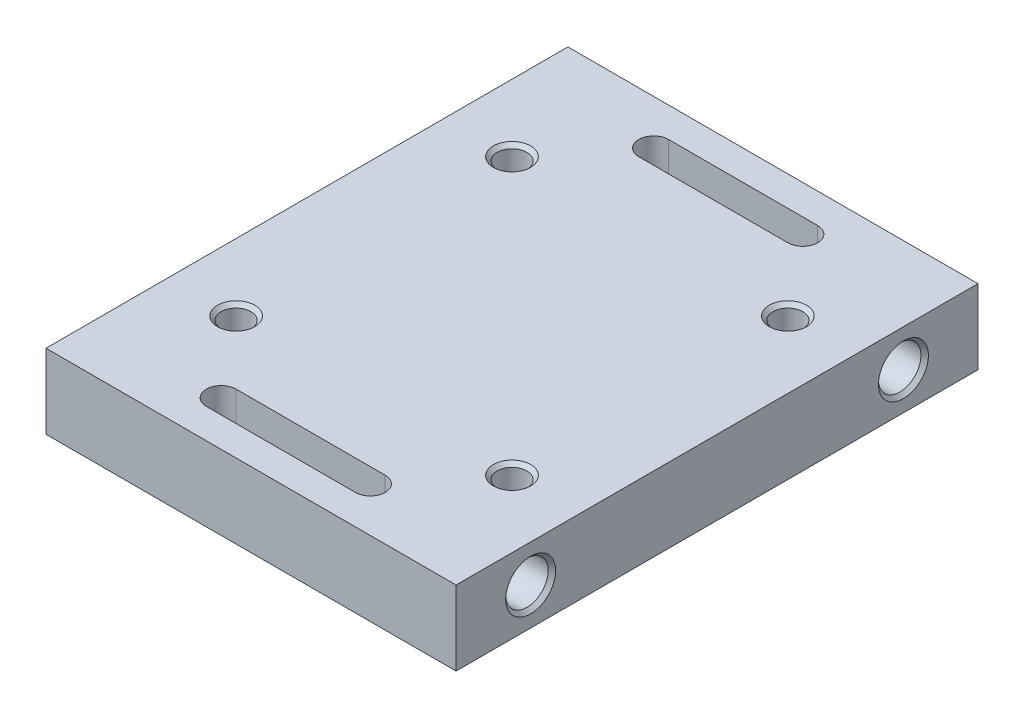
ISO-10303-21;
HEADER;
FILE_DESCRIPTION(('STEP AP214'),'2;1');
FILE_NAME('part.step','',(''),(''),'','','');
FILE_SCHEMA(('AUTOMOTIVE_DESIGN { 1 0 10303 214 1 1 1 1 }'));
ENDSEC;
DATA;
#1=APPLICATION_CONTEXT('core data for automotive mechanical design processes');
#2=APPLICATION_PROTOCOL_DEFINITION('international standard','automotive_design',2000,#1);
#3=PRODUCT_CONTEXT('',#1,'mechanical');
#4=PRODUCT('Part','Part','',(#3));
#5=PRODUCT_RELATED_PRODUCT_CATEGORY('part','',(#4));
#6=PRODUCT_DEFINITION_FORMATION('','',#4);
#7=PRODUCT_DEFINITION_CONTEXT('part definition',#1,'design');
#8=PRODUCT_DEFINITION('design','',#6,#7);
#9=PRODUCT_DEFINITION_SHAPE('','',#8);
#10=(LENGTH_UNIT() NAMED_UNIT(*) SI_UNIT(.MILLI.,.METRE.));
#11=(NAMED_UNIT(*) PLANE_ANGLE_UNIT() SI_UNIT($,.RADIAN.));
#12=(NAMED_UNIT(*) SI_UNIT($,.STERADIAN.) SOLID_ANGLE_UNIT());
#13=UNCERTAINTY_MEASURE_WITH_UNIT(LENGTH_MEASURE(1.E-05),#10,'distance_accuracy_value','');
#14=(GEOMETRIC_REPRESENTATION_CONTEXT(3) GLOBAL_UNCERTAINTY_ASSIGNED_CONTEXT((#13)) GLOBAL_UNIT_ASSIGNED_CONTEXT((#10,
#11,#12)) REPRESENTATION_CONTEXT('',''));
#15=CARTESIAN_POINT('',(0.,0.,0.));
#16=DIRECTION('',(0.,0.,1.));
#17=DIRECTION('',(1.,0.,0.));
#18=AXIS2_PLACEMENT_3D('',#15,#16,#17);
#19=CARTESIAN_POINT('',(0.,5.,0.));
#20=DIRECTION('',(0.,1.,0.));
#21=DIRECTION('',(0.,0.,1.));
#22=AXIS2_PLACEMENT_3D('',#19,#20,#21);
#23=PLANE('',#22);
#24=CARTESIAN_POINT('',(-18.5,5.,18.5));
#25=DIRECTION('',(0.,1.,0.));
#26=DIRECTION('',(0.,0.,1.));
#27=AXIS2_PLACEMENT_3D('',#24,#25,#26);
#28=CIRCLE('',#27,2.50000000000001);
#29=CARTESIAN_POINT('',(-18.5,5.,21.));
#30=VERTEX_POINT('',#29);
#31=EDGE_CURVE('E277',#30,#30,#28,.F.);
#32=ORIENTED_EDGE('',*,*,#31,.T.);
#33=EDGE_LOOP('',(#32));
#34=FACE_BOUND('',#33,.T.);
#35=CARTESIAN_POINT('',(18.5,5.,18.5));
#36=DIRECTION('',(0.,1.,0.));
#37=DIRECTION('',(0.,0.,1.));
#38=AXIS2_PLACEMENT_3D('',#35,#36,#37);
#39=CIRCLE('',#38,2.50000000000001);
#40=CARTESIAN_POINT('',(18.5,5.,21.));
#41=VERTEX_POINT('',#40);
#42=EDGE_CURVE('E272',#41,#41,#39,.F.);
#43=ORIENTED_EDGE('',*,*,#42,.T.);
#44=EDGE_LOOP('',(#43));
#45=FACE_BOUND('',#44,.T.);
#46=CARTESIAN_POINT('',(18.5,5.,-18.5));
#47=DIRECTION('',(0.,1.,0.));
#48=DIRECTION('',(0.,0.,1.));
#49=AXIS2_PLACEMENT_3D('',#46,#47,#48);
#50=CIRCLE('',#49,2.5);
#51=CARTESIAN_POINT('',(18.5,5.,-16.));
#52=VERTEX_POINT('',#51);
#53=EDGE_CURVE('E269',#52,#52,#50,.F.);
#54=ORIENTED_EDGE('',*,*,#53,.T.);
#55=EDGE_LOOP('',(#54));
#56=FACE_BOUND('',#55,.T.);
#57=CARTESIAN_POINT('',(-18.5,5.,-18.5));
#58=DIRECTION('',(0.,1.,0.));
#59=DIRECTION('',(0.,0.,1.));
#60=AXIS2_PLACEMENT_3D('',#57,#58,#59);
#61=CIRCLE('',#60,2.5);
#62=CARTESIAN_POINT('',(-18.5,5.,-16.));
#63=VERTEX_POINT('',#62);
#64=EDGE_CURVE('E270',#63,#63,#61,.F.);
#65=ORIENTED_EDGE('',*,*,#64,.T.);
#66=EDGE_LOOP('',(#65));
#67=FACE_BOUND('',#66,.T.);
#68=DIRECTION('',(1.,0.,0.));
#69=VECTOR('',#68,1.);
#70=CARTESIAN_POINT('',(-10.,5.,-27.));
#71=LINE('',#70,#69);
#72=CARTESIAN_POINT('',(-10.,5.,-27.));
#73=VERTEX_POINT('',#72);
#74=CARTESIAN_POINT('',(10.,5.,-27.));
#75=VERTEX_POINT('',#74);
#76=EDGE_CURVE('E177',#73,#75,#71,.T.);
#77=ORIENTED_EDGE('',*,*,#76,.F.);
#78=CARTESIAN_POINT('',(-10.,5.,-29.));
#79=DIRECTION('',(0.,1.,0.));
#80=DIRECTION('',(0.,0.,-1.));
#81=AXIS2_PLACEMENT_3D('',#78,#79,#80);
#82=CIRCLE('',#81,2.);
#83=CARTESIAN_POINT('',(-10.,5.,-31.));
#84=VERTEX_POINT('',#83);
#85=EDGE_CURVE('E180',#84,#73,#82,.T.);
#86=ORIENTED_EDGE('',*,*,#85,.F.);
#87=DIRECTION('',(-1.,0.,0.));
#88=VECTOR('',#87,1.);
#89=CARTESIAN_POINT('',(-10.,5.,-31.));
#90=LINE('',#89,#88);
#91=CARTESIAN_POINT('',(10.,5.,-31.));
#92=VERTEX_POINT('',#91);
#93=EDGE_CURVE('E183',#92,#84,#90,.T.);
#94=ORIENTED_EDGE('',*,*,#93,.F.);
#95=CARTESIAN_POINT('',(10.,5.,-29.));
#96=DIRECTION('',(0.,1.,0.));
#97=DIRECTION('',(0.,0.,-1.));
#98=AXIS2_PLACEMENT_3D('',#95,#96,#97);
#99=CIRCLE('',#98,2.);
#100=EDGE_CURVE('E185',#75,#92,#99,.T.);
#101=ORIENTED_EDGE('',*,*,#100,.F.);
#102=EDGE_LOOP('',(#77,#86,#94,#101));
#103=FACE_BOUND('',#102,.T.);
#104=DIRECTION('',(0.,0.,-1.));
#105=VECTOR('',#104,1.);
#106=CARTESIAN_POINT('',(27.5,5.,-35.));
#107=LINE('',#106,#105);
#108=CARTESIAN_POINT('',(27.5,5.,35.));
#109=VERTEX_POINT('',#108);
#110=CARTESIAN_POINT('',(27.5,5.,-35.));
#111=VERTEX_POINT('',#110);
#112=EDGE_CURVE('E211',#109,#111,#107,.T.);
#113=ORIENTED_EDGE('',*,*,#112,.T.);
#114=DIRECTION('',(-1.,0.,0.));
#115=VECTOR('',#114,1.);
#116=CARTESIAN_POINT('',(-27.5,5.,-35.));
#117=LINE('',#116,#115);
#118=CARTESIAN_POINT('',(-27.5,5.,-35.));
#119=VERTEX_POINT('',#118);
#120=EDGE_CURVE('E212',#111,#119,#117,.T.);
#121=ORIENTED_EDGE('',*,*,#120,.T.);
#122=DIRECTION('',(0.,0.,1.));
#123=VECTOR('',#122,1.);
#124=CARTESIAN_POINT('',(-27.5,5.,-35.));
#125=LINE('',#124,#123);
#126=CARTESIAN_POINT('',(-27.5,5.,35.));
#127=VERTEX_POINT('',#126);
#128=EDGE_CURVE('E220',#119,#127,#125,.T.);
#129=ORIENTED_EDGE('',*,*,#128,.T.);
#130=DIRECTION('',(1.,0.,0.));
#131=VECTOR('',#130,1.);
#132=CARTESIAN_POINT('',(-27.5,5.,35.));
#133=LINE('',#132,#131);
#134=EDGE_CURVE('E218',#127,#109,#133,.T.);
#135=ORIENTED_EDGE('',*,*,#134,.T.);
#136=EDGE_LOOP('',(#113,#121,#129,#135));
#137=FACE_BOUND('',#136,.T.);
#138=DIRECTION('',(-1.,0.,0.));
#139=VECTOR('',#138,1.);
#140=CARTESIAN_POINT('',(-10.,5.,27.));
#141=LINE('',#140,#139);
#142=CARTESIAN_POINT('',(10.,5.,27.));
#143=VERTEX_POINT('',#142);
#144=CARTESIAN_POINT('',(-10.,5.,27.));
#145=VERTEX_POINT('',#144);
#146=EDGE_CURVE('E140',#143,#145,#141,.T.);
#147=ORIENTED_EDGE('',*,*,#146,.F.);
#148=CARTESIAN_POINT('',(10.,5.,29.));
#149=DIRECTION('',(0.,1.,0.));
#150=DIRECTION('',(0.,0.,1.));
#151=AXIS2_PLACEMENT_3D('',#148,#149,#150);
#152=CIRCLE('',#151,2.);
#153=CARTESIAN_POINT('',(10.,5.,31.));
#154=VERTEX_POINT('',#153);
#155=EDGE_CURVE('E128',#154,#143,#152,.T.);
#156=ORIENTED_EDGE('',*,*,#155,.F.);
#157=DIRECTION('',(1.,0.,0.));
#158=VECTOR('',#157,1.);
#159=CARTESIAN_POINT('',(-10.,5.,31.));
#160=LINE('',#159,#158);
#161=CARTESIAN_POINT('',(-10.,5.,31.));
#162=VERTEX_POINT('',#161);
#163=EDGE_CURVE('E155',#162,#154,#160,.T.);
#164=ORIENTED_EDGE('',*,*,#163,.F.);
#165=CARTESIAN_POINT('',(-10.,5.,29.));
#166=DIRECTION('',(0.,1.,0.));
#167=DIRECTION('',(0.,0.,1.));
#168=AXIS2_PLACEMENT_3D('',#165,#166,#167);
#169=CIRCLE('',#168,2.);
#170=EDGE_CURVE('E147',#145,#162,#169,.T.);
#171=ORIENTED_EDGE('',*,*,#170,.F.);
#172=EDGE_LOOP('',(#147,#156,#164,#171));
#173=FACE_BOUND('',#172,.T.);
#174=ADVANCED_FACE('F37',(#34,#45,#56,#67,#103,#137,#173),#23,.T.);
#175=CARTESIAN_POINT('',(0.,-5.,0.));
#176=DIRECTION('',(0.,1.,0.));
#177=DIRECTION('',(0.,0.,1.));
#178=AXIS2_PLACEMENT_3D('',#175,#176,#177);
#179=PLANE('',#178);
#180=CARTESIAN_POINT('',(-18.5,-5.,-18.5));
#181=DIRECTION('',(0.,1.,0.));
#182=DIRECTION('',(0.,0.,1.));
#183=AXIS2_PLACEMENT_3D('',#180,#181,#182);
#184=CIRCLE('',#183,2.00000000000001);
#185=CARTESIAN_POINT('',(-18.5,-5.,-16.5));
#186=VERTEX_POINT('',#185);
#187=EDGE_CURVE('E148',#186,#186,#184,.T.);
#188=ORIENTED_EDGE('',*,*,#187,.T.);
#189=EDGE_LOOP('',(#188));
#190=FACE_BOUND('',#189,.T.);
#191=CARTESIAN_POINT('',(18.5,-5.,18.5));
#192=DIRECTION('',(0.,1.,0.));
#193=DIRECTION('',(0.,0.,1.));
#194=AXIS2_PLACEMENT_3D('',#191,#192,#193);
#195=CIRCLE('',#194,2.);
#196=CARTESIAN_POINT('',(18.5,-5.,20.5));
#197=VERTEX_POINT('',#196);
#198=EDGE_CURVE('E168',#197,#197,#195,.T.);
#199=ORIENTED_EDGE('',*,*,#198,.T.);
#200=EDGE_LOOP('',(#199));
#201=FACE_BOUND('',#200,.T.);
#202=CARTESIAN_POINT('',(18.5,-5.,-18.5));
#203=DIRECTION('',(0.,1.,0.));
#204=DIRECTION('',(0.,0.,1.));
#205=AXIS2_PLACEMENT_3D('',#202,#203,#204);
#206=CIRCLE('',#205,2.);
#207=CARTESIAN_POINT('',(18.5,-5.,-16.5));
#208=VERTEX_POINT('',#207);
#209=EDGE_CURVE('E172',#208,#208,#206,.T.);
#210=ORIENTED_EDGE('',*,*,#209,.T.);
#211=EDGE_LOOP('',(#210));
#212=FACE_BOUND('',#211,.T.);
#213=CARTESIAN_POINT('',(-10.,-5.,-29.));
#214=DIRECTION('',(0.,1.,0.));
#215=DIRECTION('',(0.,0.,-1.));
#216=AXIS2_PLACEMENT_3D('',#213,#214,#215);
#217=CIRCLE('',#216,2.);
#218=CARTESIAN_POINT('',(-10.,-5.,-31.));
#219=VERTEX_POINT('',#218);
#220=CARTESIAN_POINT('',(-10.,-5.,-27.));
#221=VERTEX_POINT('',#220);
#222=EDGE_CURVE('E178',#219,#221,#217,.T.);
#223=ORIENTED_EDGE('',*,*,#222,.T.);
#224=DIRECTION('',(1.,0.,0.));
#225=VECTOR('',#224,1.);
#226=CARTESIAN_POINT('',(-10.,-5.,-27.));
#227=LINE('',#226,#225);
#228=CARTESIAN_POINT('',(10.,-5.,-27.));
#229=VERTEX_POINT('',#228);
#230=EDGE_CURVE('E186',#221,#229,#227,.T.);
#231=ORIENTED_EDGE('',*,*,#230,.T.);
#232=CARTESIAN_POINT('',(10.,-5.,-29.));
#233=DIRECTION('',(0.,1.,0.));
#234=DIRECTION('',(0.,0.,-1.));
#235=AXIS2_PLACEMENT_3D('',#232,#233,#234);
#236=CIRCLE('',#235,2.);
#237=CARTESIAN_POINT('',(10.,-5.,-31.));
#238=VERTEX_POINT('',#237);
#239=EDGE_CURVE('E195',#229,#238,#236,.T.);
#240=ORIENTED_EDGE('',*,*,#239,.T.);
#241=DIRECTION('',(-1.,0.,0.));
#242=VECTOR('',#241,1.);
#243=CARTESIAN_POINT('',(-10.,-5.,-31.));
#244=LINE('',#243,#242);
#245=EDGE_CURVE('E179',#238,#219,#244,.T.);
#246=ORIENTED_EDGE('',*,*,#245,.T.);
#247=EDGE_LOOP('',(#223,#231,#240,#246));
#248=FACE_BOUND('',#247,.T.);
#249=DIRECTION('',(0.,0.,-1.));
#250=VECTOR('',#249,1.);
#251=CARTESIAN_POINT('',(27.5,-5.,-35.));
#252=LINE('',#251,#250);
#253=CARTESIAN_POINT('',(27.5,-5.,35.));
#254=VERTEX_POINT('',#253);
#255=CARTESIAN_POINT('',(27.5,-5.,-35.));
#256=VERTEX_POINT('',#255);
#257=EDGE_CURVE('E209',#254,#256,#252,.T.);
#258=ORIENTED_EDGE('',*,*,#257,.F.);
#259=DIRECTION('',(1.,0.,0.));
#260=VECTOR('',#259,1.);
#261=CARTESIAN_POINT('',(-27.5,-5.,35.));
#262=LINE('',#261,#260);
#263=CARTESIAN_POINT('',(-27.5,-5.,35.));
#264=VERTEX_POINT('',#263);
#265=EDGE_CURVE('E214',#264,#254,#262,.T.);
#266=ORIENTED_EDGE('',*,*,#265,.F.);
#267=DIRECTION('',(0.,0.,1.));
#268=VECTOR('',#267,1.);
#269=CARTESIAN_POINT('',(-27.5,-5.,-35.));
#270=LINE('',#269,#268);
#271=CARTESIAN_POINT('',(-27.5,-5.,-35.));
#272=VERTEX_POINT('',#271);
#273=EDGE_CURVE('E228',#272,#264,#270,.T.);
#274=ORIENTED_EDGE('',*,*,#273,.F.);
#275=DIRECTION('',(-1.,0.,0.));
#276=VECTOR('',#275,1.);
#277=CARTESIAN_POINT('',(-27.5,-5.,-35.));
#278=LINE('',#277,#276);
#279=EDGE_CURVE('E221',#256,#272,#278,.T.);
#280=ORIENTED_EDGE('',*,*,#279,.F.);
#281=EDGE_LOOP('',(#258,#266,#274,#280));
#282=FACE_BOUND('',#281,.T.);
#283=CARTESIAN_POINT('',(-18.5,-5.,18.5));
#284=DIRECTION('',(0.,1.,0.));
#285=DIRECTION('',(0.,0.,1.));
#286=AXIS2_PLACEMENT_3D('',#283,#284,#285);
#287=CIRCLE('',#286,2.);
#288=CARTESIAN_POINT('',(-18.5,-5.,20.5));
#289=VERTEX_POINT('',#288);
#290=EDGE_CURVE('E210',#289,#289,#287,.T.);
#291=ORIENTED_EDGE('',*,*,#290,.T.);
#292=EDGE_LOOP('',(#291));
#293=FACE_BOUND('',#292,.T.);
#294=CARTESIAN_POINT('',(10.,-5.,29.));
#295=DIRECTION('',(0.,1.,0.));
#296=DIRECTION('',(0.,0.,1.));
#297=AXIS2_PLACEMENT_3D('',#294,#295,#296);
#298=CIRCLE('',#297,2.);
#299=CARTESIAN_POINT('',(10.,-5.,31.));
#300=VERTEX_POINT('',#299);
#301=CARTESIAN_POINT('',(10.,-5.,27.));
#302=VERTEX_POINT('',#301);
#303=EDGE_CURVE('E65',#300,#302,#298,.T.);
#304=ORIENTED_EDGE('',*,*,#303,.T.);
#305=DIRECTION('',(-1.,0.,0.));
#306=VECTOR('',#305,1.);
#307=CARTESIAN_POINT('',(-10.,-5.,27.));
#308=LINE('',#307,#306);
#309=CARTESIAN_POINT('',(-10.,-5.,27.));
#310=VERTEX_POINT('',#309);
#311=EDGE_CURVE('E144',#302,#310,#308,.T.);
#312=ORIENTED_EDGE('',*,*,#311,.T.);
#313=CARTESIAN_POINT('',(-10.,-5.,29.));
#314=DIRECTION('',(0.,1.,0.));
#315=DIRECTION('',(0.,0.,1.));
#316=AXIS2_PLACEMENT_3D('',#313,#314,#315);
#317=CIRCLE('',#316,2.);
#318=CARTESIAN_POINT('',(-10.,-5.,31.));
#319=VERTEX_POINT('',#318);
#320=EDGE_CURVE('E159',#310,#319,#317,.T.);
#321=ORIENTED_EDGE('',*,*,#320,.T.);
#322=DIRECTION('',(1.,0.,0.));
#323=VECTOR('',#322,1.);
#324=CARTESIAN_POINT('',(-10.,-5.,31.));
#325=LINE('',#324,#323);
#326=EDGE_CURVE('E136',#319,#300,#325,.T.);
#327=ORIENTED_EDGE('',*,*,#326,.T.);
#328=EDGE_LOOP('',(#304,#312,#321,#327));
#329=FACE_BOUND('',#328,.T.);
#330=ADVANCED_FACE('F304',(#190,#201,#212,#248,#282,#293,#329),#179,.F.);
#331=CARTESIAN_POINT('',(27.5,5.,-35.));
#332=DIRECTION('',(-1.,0.,0.));
#333=DIRECTION('',(0.,0.,1.));
#334=AXIS2_PLACEMENT_3D('',#331,#332,#333);
#335=PLANE('',#334);
#336=CARTESIAN_POINT('',(27.5,0.,-25.));
#337=DIRECTION('',(-1.,0.,0.));
#338=DIRECTION('',(0.,0.,1.));
#339=AXIS2_PLACEMENT_3D('',#336,#337,#338);
#340=CIRCLE('',#339,3.35000000000001);
#341=CARTESIAN_POINT('',(27.5,0.,-21.65));
#342=VERTEX_POINT('',#341);
#343=EDGE_CURVE('E256',#342,#342,#340,.T.);
#344=ORIENTED_EDGE('',*,*,#343,.T.);
#345=EDGE_LOOP('',(#344));
#346=FACE_BOUND('',#345,.T.);
#347=CARTESIAN_POINT('',(27.5,0.,25.));
#348=DIRECTION('',(-1.,0.,0.));
#349=DIRECTION('',(0.,0.,1.));
#350=AXIS2_PLACEMENT_3D('',#347,#348,#349);
#351=CIRCLE('',#350,3.35000000000001);
#352=CARTESIAN_POINT('',(27.5,0.,28.35));
#353=VERTEX_POINT('',#352);
#354=EDGE_CURVE('E254',#353,#353,#351,.T.);
#355=ORIENTED_EDGE('',*,*,#354,.T.);
#356=EDGE_LOOP('',(#355));
#357=FACE_BOUND('',#356,.T.);
#358=ORIENTED_EDGE('',*,*,#257,.T.);
#359=DIRECTION('',(0.,-1.,0.));
#360=VECTOR('',#359,1.);
#361=CARTESIAN_POINT('',(27.5,5.,-35.));
#362=LINE('',#361,#360);
#363=EDGE_CURVE('E240',#111,#256,#362,.T.);
#364=ORIENTED_EDGE('',*,*,#363,.F.);
#365=ORIENTED_EDGE('',*,*,#112,.F.);
#366=DIRECTION('',(0.,-1.,0.));
#367=VECTOR('',#366,1.);
#368=CARTESIAN_POINT('',(27.5,5.,35.));
#369=LINE('',#368,#367);
#370=EDGE_CURVE('E222',#109,#254,#369,.T.);
#371=ORIENTED_EDGE('',*,*,#370,.T.);
#372=EDGE_LOOP('',(#358,#364,#365,#371));
#373=FACE_BOUND('',#372,.T.);
#374=ADVANCED_FACE('F309',(#346,#357,#373),#335,.F.);
#375=CARTESIAN_POINT('',(-27.5,5.,-35.));
#376=DIRECTION('',(0.,0.,1.));
#377=DIRECTION('',(1.,0.,0.));
#378=AXIS2_PLACEMENT_3D('',#375,#376,#377);
#379=PLANE('',#378);
#380=ORIENTED_EDGE('',*,*,#279,.T.);
#381=DIRECTION('',(0.,-1.,0.));
#382=VECTOR('',#381,1.);
#383=CARTESIAN_POINT('',(-27.5,5.,-35.));
#384=LINE('',#383,#382);
#385=EDGE_CURVE('E232',#119,#272,#384,.T.);
#386=ORIENTED_EDGE('',*,*,#385,.F.);
#387=ORIENTED_EDGE('',*,*,#120,.F.);
#388=ORIENTED_EDGE('',*,*,#363,.T.);
#389=EDGE_LOOP('',(#380,#386,#387,#388));
#390=FACE_BOUND('',#389,.T.);
#391=ADVANCED_FACE('F324',(#390),#379,.F.);
#392=CARTESIAN_POINT('',(-27.5,5.,-35.));
#393=DIRECTION('',(1.,0.,0.));
#394=DIRECTION('',(0.,0.,-1.));
#395=AXIS2_PLACEMENT_3D('',#392,#393,#394);
#396=PLANE('',#395);
#397=CARTESIAN_POINT('',(-27.5,0.,-25.));
#398=DIRECTION('',(1.,0.,0.));
#399=DIRECTION('',(0.,0.,-1.));
#400=AXIS2_PLACEMENT_3D('',#397,#398,#399);
#401=CIRCLE('',#400,3.35000000000001);
#402=CARTESIAN_POINT('',(-27.5,0.,-28.35));
#403=VERTEX_POINT('',#402);
#404=EDGE_CURVE('E242',#403,#403,#401,.T.);
#405=ORIENTED_EDGE('',*,*,#404,.T.);
#406=EDGE_LOOP('',(#405));
#407=FACE_BOUND('',#406,.T.);
#408=CARTESIAN_POINT('',(-27.5,0.,25.));
#409=DIRECTION('',(1.,0.,0.));
#410=DIRECTION('',(0.,0.,-1.));
#411=AXIS2_PLACEMENT_3D('',#408,#409,#410);
#412=CIRCLE('',#411,3.35000000000002);
#413=CARTESIAN_POINT('',(-27.5,0.,21.65));
#414=VERTEX_POINT('',#413);
#415=EDGE_CURVE('E238',#414,#414,#412,.T.);
#416=ORIENTED_EDGE('',*,*,#415,.T.);
#417=EDGE_LOOP('',(#416));
#418=FACE_BOUND('',#417,.T.);
#419=ORIENTED_EDGE('',*,*,#273,.T.);
#420=DIRECTION('',(0.,-1.,0.));
#421=VECTOR('',#420,1.);
#422=CARTESIAN_POINT('',(-27.5,5.,35.));
#423=LINE('',#422,#421);
#424=EDGE_CURVE('E233',#127,#264,#423,.T.);
#425=ORIENTED_EDGE('',*,*,#424,.F.);
#426=ORIENTED_EDGE('',*,*,#128,.F.);
#427=ORIENTED_EDGE('',*,*,#385,.T.);
#428=EDGE_LOOP('',(#419,#425,#426,#427));
#429=FACE_BOUND('',#428,.T.);
#430=ADVANCED_FACE('F321',(#407,#418,#429),#396,.F.);
#431=CARTESIAN_POINT('',(-27.5,5.,35.));
#432=DIRECTION('',(0.,0.,-1.));
#433=DIRECTION('',(-1.,0.,0.));
#434=AXIS2_PLACEMENT_3D('',#431,#432,#433);
#435=PLANE('',#434);
#436=ORIENTED_EDGE('',*,*,#265,.T.);
#437=ORIENTED_EDGE('',*,*,#370,.F.);
#438=ORIENTED_EDGE('',*,*,#134,.F.);
#439=ORIENTED_EDGE('',*,*,#424,.T.);
#440=EDGE_LOOP('',(#436,#437,#438,#439));
#441=FACE_BOUND('',#440,.T.);
#442=ADVANCED_FACE('F318',(#441),#435,.F.);
#443=CARTESIAN_POINT('',(-18.5,5.,18.5));
#444=DIRECTION('',(0.,-1.,0.));
#445=DIRECTION('',(0.,0.,-1.));
#446=AXIS2_PLACEMENT_3D('',#443,#444,#445);
#447=CYLINDRICAL_SURFACE('',#446,2.);
#448=CARTESIAN_POINT('',(-18.5,4.49999999999999,18.5));
#449=DIRECTION('',(0.,1.,0.));
#450=DIRECTION('',(0.,0.,1.));
#451=AXIS2_PLACEMENT_3D('',#448,#449,#450);
#452=CIRCLE('',#451,2.);
#453=CARTESIAN_POINT('',(-18.5,4.49999999999999,20.5));
#454=VERTEX_POINT('',#453);
#455=EDGE_CURVE('E262',#454,#454,#452,.T.);
#456=ORIENTED_EDGE('',*,*,#455,.T.);
#457=EDGE_LOOP('',(#456));
#458=FACE_BOUND('',#457,.T.);
#459=ORIENTED_EDGE('',*,*,#290,.F.);
#460=EDGE_LOOP('',(#459));
#461=FACE_BOUND('',#460,.T.);
#462=ADVANCED_FACE('F312',(#458,#461),#447,.F.);
#463=CARTESIAN_POINT('',(-10.,5.,-29.));
#464=DIRECTION('',(0.,-1.,0.));
#465=DIRECTION('',(0.,0.,-1.));
#466=AXIS2_PLACEMENT_3D('',#463,#464,#465);
#467=CYLINDRICAL_SURFACE('',#466,2.);
#468=ORIENTED_EDGE('',*,*,#222,.F.);
#469=DIRECTION('',(0.,-1.,0.));
#470=VECTOR('',#469,1.);
#471=CARTESIAN_POINT('',(-10.,5.,-31.));
#472=LINE('',#471,#470);
#473=EDGE_CURVE('E189',#84,#219,#472,.T.);
#474=ORIENTED_EDGE('',*,*,#473,.F.);
#475=ORIENTED_EDGE('',*,*,#85,.T.);
#476=DIRECTION('',(0.,-1.,0.));
#477=VECTOR('',#476,1.);
#478=CARTESIAN_POINT('',(-10.,5.,-27.));
#479=LINE('',#478,#477);
#480=EDGE_CURVE('E204',#73,#221,#479,.T.);
#481=ORIENTED_EDGE('',*,*,#480,.T.);
#482=EDGE_LOOP('',(#468,#474,#475,#481));
#483=FACE_BOUND('',#482,.T.);
#484=ADVANCED_FACE('F381',(#483),#467,.F.);
#485=CARTESIAN_POINT('',(-10.,5.,-27.));
#486=DIRECTION('',(0.,0.,-1.));
#487=DIRECTION('',(-1.,0.,0.));
#488=AXIS2_PLACEMENT_3D('',#485,#486,#487);
#489=PLANE('',#488);
#490=ORIENTED_EDGE('',*,*,#230,.F.);
#491=ORIENTED_EDGE('',*,*,#480,.F.);
#492=ORIENTED_EDGE('',*,*,#76,.T.);
#493=DIRECTION('',(0.,-1.,0.));
#494=VECTOR('',#493,1.);
#495=CARTESIAN_POINT('',(10.,5.,-27.));
#496=LINE('',#495,#494);
#497=EDGE_CURVE('E205',#75,#229,#496,.T.);
#498=ORIENTED_EDGE('',*,*,#497,.T.);
#499=EDGE_LOOP('',(#490,#491,#492,#498));
#500=FACE_BOUND('',#499,.T.);
#501=ADVANCED_FACE('F424',(#500),#489,.T.);
#502=CARTESIAN_POINT('',(10.,5.,-29.));
#503=DIRECTION('',(0.,-1.,0.));
#504=DIRECTION('',(0.,0.,-1.));
#505=AXIS2_PLACEMENT_3D('',#502,#503,#504);
#506=CYLINDRICAL_SURFACE('',#505,2.);
#507=ORIENTED_EDGE('',*,*,#239,.F.);
#508=ORIENTED_EDGE('',*,*,#497,.F.);
#509=ORIENTED_EDGE('',*,*,#100,.T.);
#510=DIRECTION('',(0.,-1.,0.));
#511=VECTOR('',#510,1.);
#512=CARTESIAN_POINT('',(10.,5.,-31.));
#513=LINE('',#512,#511);
#514=EDGE_CURVE('E199',#92,#238,#513,.T.);
#515=ORIENTED_EDGE('',*,*,#514,.T.);
#516=EDGE_LOOP('',(#507,#508,#509,#515));
#517=FACE_BOUND('',#516,.T.);
#518=ADVANCED_FACE('F419',(#517),#506,.F.);
#519=CARTESIAN_POINT('',(-10.,5.,-31.));
#520=DIRECTION('',(0.,0.,1.));
#521=DIRECTION('',(1.,0.,0.));
#522=AXIS2_PLACEMENT_3D('',#519,#520,#521);
#523=PLANE('',#522);
#524=ORIENTED_EDGE('',*,*,#245,.F.);
#525=ORIENTED_EDGE('',*,*,#514,.F.);
#526=ORIENTED_EDGE('',*,*,#93,.T.);
#527=ORIENTED_EDGE('',*,*,#473,.T.);
#528=EDGE_LOOP('',(#524,#525,#526,#527));
#529=FACE_BOUND('',#528,.T.);
#530=ADVANCED_FACE('F417',(#529),#523,.T.);
#531=CARTESIAN_POINT('',(18.5,5.,-18.5));
#532=DIRECTION('',(0.,-1.,0.));
#533=DIRECTION('',(0.,0.,-1.));
#534=AXIS2_PLACEMENT_3D('',#531,#532,#533);
#535=CYLINDRICAL_SURFACE('',#534,2.);
#536=CARTESIAN_POINT('',(18.5,4.49999999999999,-18.5));
#537=DIRECTION('',(0.,1.,0.));
#538=DIRECTION('',(0.,0.,1.));
#539=AXIS2_PLACEMENT_3D('',#536,#537,#538);
#540=CIRCLE('',#539,2.);
#541=CARTESIAN_POINT('',(18.5,4.49999999999999,-16.5));
#542=VERTEX_POINT('',#541);
#543=EDGE_CURVE('E47',#542,#542,#540,.T.);
#544=ORIENTED_EDGE('',*,*,#543,.T.);
#545=EDGE_LOOP('',(#544));
#546=FACE_BOUND('',#545,.T.);
#547=ORIENTED_EDGE('',*,*,#209,.F.);
#548=EDGE_LOOP('',(#547));
#549=FACE_BOUND('',#548,.T.);
#550=ADVANCED_FACE('F285',(#546,#549),#535,.F.);
#551=CARTESIAN_POINT('',(18.5,5.,18.5));
#552=DIRECTION('',(0.,-1.,0.));
#553=DIRECTION('',(0.,0.,-1.));
#554=AXIS2_PLACEMENT_3D('',#551,#552,#553);
#555=CYLINDRICAL_SURFACE('',#554,2.);
#556=CARTESIAN_POINT('',(18.5,4.49999999999999,18.5));
#557=DIRECTION('',(0.,1.,0.));
#558=DIRECTION('',(0.,0.,1.));
#559=AXIS2_PLACEMENT_3D('',#556,#557,#558);
#560=CIRCLE('',#559,2.);
#561=CARTESIAN_POINT('',(18.5,4.49999999999999,20.5));
#562=VERTEX_POINT('',#561);
#563=EDGE_CURVE('E276',#562,#562,#560,.T.);
#564=ORIENTED_EDGE('',*,*,#563,.T.);
#565=EDGE_LOOP('',(#564));
#566=FACE_BOUND('',#565,.T.);
#567=ORIENTED_EDGE('',*,*,#198,.F.);
#568=EDGE_LOOP('',(#567));
#569=FACE_BOUND('',#568,.T.);
#570=ADVANCED_FACE('F406',(#566,#569),#555,.F.);
#571=CARTESIAN_POINT('',(-18.5,5.,-18.5));
#572=DIRECTION('',(0.,-1.,0.));
#573=DIRECTION('',(0.,0.,-1.));
#574=AXIS2_PLACEMENT_3D('',#571,#572,#573);
#575=CYLINDRICAL_SURFACE('',#574,2.00000000000001);
#576=CARTESIAN_POINT('',(-18.5,4.5,-18.5));
#577=DIRECTION('',(0.,1.,0.));
#578=DIRECTION('',(0.,0.,1.));
#579=AXIS2_PLACEMENT_3D('',#576,#577,#578);
#580=CIRCLE('',#579,2.00000000000001);
#581=CARTESIAN_POINT('',(-18.5,4.5,-16.5));
#582=VERTEX_POINT('',#581);
#583=EDGE_CURVE('E11',#582,#582,#580,.T.);
#584=ORIENTED_EDGE('',*,*,#583,.T.);
#585=EDGE_LOOP('',(#584));
#586=FACE_BOUND('',#585,.T.);
#587=ORIENTED_EDGE('',*,*,#187,.F.);
#588=EDGE_LOOP('',(#587));
#589=FACE_BOUND('',#588,.T.);
#590=ADVANCED_FACE('F409',(#586,#589),#575,.F.);
#591=CARTESIAN_POINT('',(10.,5.,29.));
#592=DIRECTION('',(0.,-1.,0.));
#593=DIRECTION('',(0.,0.,-1.));
#594=AXIS2_PLACEMENT_3D('',#591,#592,#593);
#595=CYLINDRICAL_SURFACE('',#594,2.);
#596=ORIENTED_EDGE('',*,*,#303,.F.);
#597=DIRECTION('',(0.,-1.,0.));
#598=VECTOR('',#597,1.);
#599=CARTESIAN_POINT('',(10.,5.,31.));
#600=LINE('',#599,#598);
#601=EDGE_CURVE('E135',#154,#300,#600,.T.);
#602=ORIENTED_EDGE('',*,*,#601,.F.);
#603=ORIENTED_EDGE('',*,*,#155,.T.);
#604=DIRECTION('',(0.,-1.,0.));
#605=VECTOR('',#604,1.);
#606=CARTESIAN_POINT('',(10.,5.,27.));
#607=LINE('',#606,#605);
#608=EDGE_CURVE('E132',#143,#302,#607,.T.);
#609=ORIENTED_EDGE('',*,*,#608,.T.);
#610=EDGE_LOOP('',(#596,#602,#603,#609));
#611=FACE_BOUND('',#610,.T.);
#612=ADVANCED_FACE('F134',(#611),#595,.F.);
#613=CARTESIAN_POINT('',(-10.,5.,27.));
#614=DIRECTION('',(0.,0.,1.));
#615=DIRECTION('',(1.,0.,0.));
#616=AXIS2_PLACEMENT_3D('',#613,#614,#615);
#617=PLANE('',#616);
#618=ORIENTED_EDGE('',*,*,#311,.F.);
#619=ORIENTED_EDGE('',*,*,#608,.F.);
#620=ORIENTED_EDGE('',*,*,#146,.T.);
#621=DIRECTION('',(0.,-1.,0.));
#622=VECTOR('',#621,1.);
#623=CARTESIAN_POINT('',(-10.,5.,27.));
#624=LINE('',#623,#622);
#625=EDGE_CURVE('E150',#145,#310,#624,.T.);
#626=ORIENTED_EDGE('',*,*,#625,.T.);
#627=EDGE_LOOP('',(#618,#619,#620,#626));
#628=FACE_BOUND('',#627,.T.);
#629=ADVANCED_FACE('F142',(#628),#617,.T.);
#630=CARTESIAN_POINT('',(-10.,5.,29.));
#631=DIRECTION('',(0.,-1.,0.));
#632=DIRECTION('',(0.,0.,-1.));
#633=AXIS2_PLACEMENT_3D('',#630,#631,#632);
#634=CYLINDRICAL_SURFACE('',#633,2.);
#635=ORIENTED_EDGE('',*,*,#320,.F.);
#636=ORIENTED_EDGE('',*,*,#625,.F.);
#637=ORIENTED_EDGE('',*,*,#170,.T.);
#638=DIRECTION('',(0.,-1.,0.));
#639=VECTOR('',#638,1.);
#640=CARTESIAN_POINT('',(-10.,5.,31.));
#641=LINE('',#640,#639);
#642=EDGE_CURVE('E57',#162,#319,#641,.T.);
#643=ORIENTED_EDGE('',*,*,#642,.T.);
#644=EDGE_LOOP('',(#635,#636,#637,#643));
#645=FACE_BOUND('',#644,.T.);
#646=ADVANCED_FACE('F386',(#645),#634,.F.);
#647=CARTESIAN_POINT('',(-10.,5.,31.));
#648=DIRECTION('',(0.,0.,-1.));
#649=DIRECTION('',(-1.,0.,0.));
#650=AXIS2_PLACEMENT_3D('',#647,#648,#649);
#651=PLANE('',#650);
#652=ORIENTED_EDGE('',*,*,#326,.F.);
#653=ORIENTED_EDGE('',*,*,#642,.F.);
#654=ORIENTED_EDGE('',*,*,#163,.T.);
#655=ORIENTED_EDGE('',*,*,#601,.T.);
#656=EDGE_LOOP('',(#652,#653,#654,#655));
#657=FACE_BOUND('',#656,.T.);
#658=ADVANCED_FACE('F387',(#657),#651,.T.);
#659=CARTESIAN_POINT('',(19.5,0.,-25.));
#660=DIRECTION('',(1.,0.,0.));
#661=DIRECTION('',(0.,0.,-1.));
#662=AXIS2_PLACEMENT_3D('',#659,#660,#661);
#663=CYLINDRICAL_SURFACE('',#662,2.85);
#664=CARTESIAN_POINT('',(27.,0.,-25.));
#665=DIRECTION('',(-1.,0.,0.));
#666=DIRECTION('',(0.,0.,1.));
#667=AXIS2_PLACEMENT_3D('',#664,#665,#666);
#668=CIRCLE('',#667,2.85);
#669=CARTESIAN_POINT('',(27.,0.,-22.15));
#670=VERTEX_POINT('',#669);
#671=EDGE_CURVE('E252',#670,#670,#668,.F.);
#672=ORIENTED_EDGE('',*,*,#671,.T.);
#673=EDGE_LOOP('',(#672));
#674=FACE_BOUND('',#673,.T.);
#675=CARTESIAN_POINT('',(19.5,0.,-25.));
#676=DIRECTION('',(1.,0.,0.));
#677=DIRECTION('',(0.,0.,1.));
#678=AXIS2_PLACEMENT_3D('',#675,#676,#677);
#679=CIRCLE('',#678,2.85);
#680=CARTESIAN_POINT('',(19.5,0.,-22.15));
#681=VERTEX_POINT('',#680);
#682=EDGE_CURVE('E617',#681,#681,#679,.T.);
#683=ORIENTED_EDGE('',*,*,#682,.F.);
#684=EDGE_LOOP('',(#683));
#685=FACE_BOUND('',#684,.T.);
#686=ADVANCED_FACE('F389',(#674,#685),#663,.F.);
#687=CARTESIAN_POINT('',(19.5,0.,-25.));
#688=DIRECTION('',(-1.,0.,0.));
#689=DIRECTION('',(0.,0.,1.));
#690=AXIS2_PLACEMENT_3D('',#687,#688,#689);
#691=PLANE('',#690);
#692=ORIENTED_EDGE('',*,*,#682,.T.);
#693=EDGE_LOOP('',(#692));
#694=FACE_BOUND('',#693,.T.);
#695=ADVANCED_FACE('F398',(#694),#691,.F.);
#696=CARTESIAN_POINT('',(19.5,0.,25.));
#697=DIRECTION('',(1.,0.,0.));
#698=DIRECTION('',(0.,0.,-1.));
#699=AXIS2_PLACEMENT_3D('',#696,#697,#698);
#700=CYLINDRICAL_SURFACE('',#699,2.85);
#701=CARTESIAN_POINT('',(27.,0.,25.));
#702=DIRECTION('',(-1.,0.,0.));
#703=DIRECTION('',(0.,0.,1.));
#704=AXIS2_PLACEMENT_3D('',#701,#702,#703);
#705=CIRCLE('',#704,2.85);
#706=CARTESIAN_POINT('',(27.,0.,27.85));
#707=VERTEX_POINT('',#706);
#708=EDGE_CURVE('E261',#707,#707,#705,.F.);
#709=ORIENTED_EDGE('',*,*,#708,.T.);
#710=EDGE_LOOP('',(#709));
#711=FACE_BOUND('',#710,.T.);
#712=CARTESIAN_POINT('',(19.5,0.,25.));
#713=DIRECTION('',(1.,0.,0.));
#714=DIRECTION('',(0.,0.,-1.));
#715=AXIS2_PLACEMENT_3D('',#712,#713,#714);
#716=CIRCLE('',#715,2.85);
#717=CARTESIAN_POINT('',(19.5,0.,22.15));
#718=VERTEX_POINT('',#717);
#719=EDGE_CURVE('E158',#718,#718,#716,.T.);
#720=ORIENTED_EDGE('',*,*,#719,.F.);
#721=EDGE_LOOP('',(#720));
#722=FACE_BOUND('',#721,.T.);
#723=ADVANCED_FACE('F515',(#711,#722),#700,.F.);
#724=CARTESIAN_POINT('',(19.5,0.,25.));
#725=DIRECTION('',(1.,0.,0.));
#726=DIRECTION('',(0.,0.,-1.));
#727=AXIS2_PLACEMENT_3D('',#724,#725,#726);
#728=PLANE('',#727);
#729=ORIENTED_EDGE('',*,*,#719,.T.);
#730=EDGE_LOOP('',(#729));
#731=FACE_BOUND('',#730,.T.);
#732=ADVANCED_FACE('F522',(#731),#728,.T.);
#733=CARTESIAN_POINT('',(-19.5,0.,-25.));
#734=DIRECTION('',(-1.,0.,0.));
#735=DIRECTION('',(0.,0.,1.));
#736=AXIS2_PLACEMENT_3D('',#733,#734,#735);
#737=CYLINDRICAL_SURFACE('',#736,2.85);
#738=CARTESIAN_POINT('',(-27.,0.,-25.));
#739=DIRECTION('',(1.,0.,0.));
#740=DIRECTION('',(0.,0.,-1.));
#741=AXIS2_PLACEMENT_3D('',#738,#739,#740);
#742=CIRCLE('',#741,2.85);
#743=CARTESIAN_POINT('',(-27.,0.,-27.85));
#744=VERTEX_POINT('',#743);
#745=EDGE_CURVE('E247',#744,#744,#742,.F.);
#746=ORIENTED_EDGE('',*,*,#745,.T.);
#747=EDGE_LOOP('',(#746));
#748=FACE_BOUND('',#747,.T.);
#749=CARTESIAN_POINT('',(-19.5,0.,-25.));
#750=DIRECTION('',(1.,0.,0.));
#751=DIRECTION('',(0.,0.,1.));
#752=AXIS2_PLACEMENT_3D('',#749,#750,#751);
#753=CIRCLE('',#752,2.85);
#754=CARTESIAN_POINT('',(-19.5,0.,-22.15));
#755=VERTEX_POINT('',#754);
#756=EDGE_CURVE('E619',#755,#755,#753,.T.);
#757=ORIENTED_EDGE('',*,*,#756,.T.);
#758=EDGE_LOOP('',(#757));
#759=FACE_BOUND('',#758,.T.);
#760=ADVANCED_FACE('F533',(#748,#759),#737,.F.);
#761=CARTESIAN_POINT('',(-19.5,0.,-25.));
#762=DIRECTION('',(1.,0.,0.));
#763=DIRECTION('',(0.,0.,1.));
#764=AXIS2_PLACEMENT_3D('',#761,#762,#763);
#765=PLANE('',#764);
#766=ORIENTED_EDGE('',*,*,#756,.F.);
#767=EDGE_LOOP('',(#766));
#768=FACE_BOUND('',#767,.T.);
#769=ADVANCED_FACE('F541',(#768),#765,.F.);
#770=CARTESIAN_POINT('',(-19.5,0.,25.));
#771=DIRECTION('',(-1.,0.,0.));
#772=DIRECTION('',(0.,0.,1.));
#773=AXIS2_PLACEMENT_3D('',#770,#771,#772);
#774=CYLINDRICAL_SURFACE('',#773,2.85);
#775=CARTESIAN_POINT('',(-27.,0.,25.));
#776=DIRECTION('',(1.,0.,0.));
#777=DIRECTION('',(0.,0.,-1.));
#778=AXIS2_PLACEMENT_3D('',#775,#776,#777);
#779=CIRCLE('',#778,2.85);
#780=CARTESIAN_POINT('',(-27.,0.,22.15));
#781=VERTEX_POINT('',#780);
#782=EDGE_CURVE('E246',#781,#781,#779,.F.);
#783=ORIENTED_EDGE('',*,*,#782,.T.);
#784=EDGE_LOOP('',(#783));
#785=FACE_BOUND('',#784,.T.);
#786=CARTESIAN_POINT('',(-19.5,0.,25.));
#787=DIRECTION('',(1.,0.,0.));
#788=DIRECTION('',(0.,0.,-1.));
#789=AXIS2_PLACEMENT_3D('',#786,#787,#788);
#790=CIRCLE('',#789,2.85);
#791=CARTESIAN_POINT('',(-19.5,0.,22.15));
#792=VERTEX_POINT('',#791);
#793=EDGE_CURVE('E620',#792,#792,#790,.T.);
#794=ORIENTED_EDGE('',*,*,#793,.T.);
#795=EDGE_LOOP('',(#794));
#796=FACE_BOUND('',#795,.T.);
#797=ADVANCED_FACE('F552',(#785,#796),#774,.F.);
#798=CARTESIAN_POINT('',(-19.5,0.,25.));
#799=DIRECTION('',(-1.,0.,0.));
#800=DIRECTION('',(0.,0.,-1.));
#801=AXIS2_PLACEMENT_3D('',#798,#799,#800);
#802=PLANE('',#801);
#803=ORIENTED_EDGE('',*,*,#793,.F.);
#804=EDGE_LOOP('',(#803));
#805=FACE_BOUND('',#804,.T.);
#806=ADVANCED_FACE('F336',(#805),#802,.T.);
#807=CARTESIAN_POINT('',(-27.5,0.,-25.));
#808=DIRECTION('',(-1.,0.,0.));
#809=DIRECTION('',(0.,0.,1.));
#810=AXIS2_PLACEMENT_3D('',#807,#808,#809);
#811=CONICAL_SURFACE('',#810,3.35000000000001,0.785398163397434);
#812=ORIENTED_EDGE('',*,*,#745,.F.);
#813=EDGE_LOOP('',(#812));
#814=FACE_BOUND('',#813,.T.);
#815=ORIENTED_EDGE('',*,*,#404,.F.);
#816=EDGE_LOOP('',(#815));
#817=FACE_BOUND('',#816,.T.);
#818=ADVANCED_FACE('F334',(#814,#817),#811,.F.);
#819=CARTESIAN_POINT('',(-27.5,0.,25.));
#820=DIRECTION('',(-1.,0.,0.));
#821=DIRECTION('',(0.,0.,1.));
#822=AXIS2_PLACEMENT_3D('',#819,#820,#821);
#823=CONICAL_SURFACE('',#822,3.35000000000001,0.785398163397454);
#824=ORIENTED_EDGE('',*,*,#782,.F.);
#825=EDGE_LOOP('',(#824));
#826=FACE_BOUND('',#825,.T.);
#827=ORIENTED_EDGE('',*,*,#415,.F.);
#828=EDGE_LOOP('',(#827));
#829=FACE_BOUND('',#828,.T.);
#830=ADVANCED_FACE('F340',(#826,#829),#823,.F.);
#831=CARTESIAN_POINT('',(27.,0.,-25.));
#832=DIRECTION('',(1.,0.,0.));
#833=DIRECTION('',(0.,0.,-1.));
#834=AXIS2_PLACEMENT_3D('',#831,#832,#833);
#835=CONICAL_SURFACE('',#834,2.85,0.785398163397447);
#836=ORIENTED_EDGE('',*,*,#343,.F.);
#837=EDGE_LOOP('',(#836));
#838=FACE_BOUND('',#837,.T.);
#839=ORIENTED_EDGE('',*,*,#671,.F.);
#840=EDGE_LOOP('',(#839));
#841=FACE_BOUND('',#840,.T.);
#842=ADVANCED_FACE('F350',(#838,#841),#835,.F.);
#843=CARTESIAN_POINT('',(27.,0.,25.));
#844=DIRECTION('',(1.,0.,0.));
#845=DIRECTION('',(0.,0.,-1.));
#846=AXIS2_PLACEMENT_3D('',#843,#844,#845);
#847=CONICAL_SURFACE('',#846,2.85,0.785398163397447);
#848=ORIENTED_EDGE('',*,*,#354,.F.);
#849=EDGE_LOOP('',(#848));
#850=FACE_BOUND('',#849,.T.);
#851=ORIENTED_EDGE('',*,*,#708,.F.);
#852=EDGE_LOOP('',(#851));
#853=FACE_BOUND('',#852,.T.);
#854=ADVANCED_FACE('F355',(#850,#853),#847,.F.);
#855=CARTESIAN_POINT('',(-18.5,4.49999999999999,18.5));
#856=DIRECTION('',(0.,1.,0.));
#857=DIRECTION('',(0.,0.,1.));
#858=AXIS2_PLACEMENT_3D('',#855,#856,#857);
#859=CONICAL_SURFACE('',#858,2.,0.785398163397445);
#860=ORIENTED_EDGE('',*,*,#31,.F.);
#861=EDGE_LOOP('',(#860));
#862=FACE_BOUND('',#861,.T.);
#863=ORIENTED_EDGE('',*,*,#455,.F.);
#864=EDGE_LOOP('',(#863));
#865=FACE_BOUND('',#864,.T.);
#866=ADVANCED_FACE('F298',(#862,#865),#859,.F.);
#867=CARTESIAN_POINT('',(18.5,4.49999999999999,18.5));
#868=DIRECTION('',(0.,1.,0.));
#869=DIRECTION('',(0.,0.,1.));
#870=AXIS2_PLACEMENT_3D('',#867,#868,#869);
#871=CONICAL_SURFACE('',#870,2.,0.785398163397445);
#872=ORIENTED_EDGE('',*,*,#42,.F.);
#873=EDGE_LOOP('',(#872));
#874=FACE_BOUND('',#873,.T.);
#875=ORIENTED_EDGE('',*,*,#563,.F.);
#876=EDGE_LOOP('',(#875));
#877=FACE_BOUND('',#876,.T.);
#878=ADVANCED_FACE('F287',(#874,#877),#871,.F.);
#879=CARTESIAN_POINT('',(18.5,4.49999999999999,-18.5));
#880=DIRECTION('',(0.,1.,0.));
#881=DIRECTION('',(0.,0.,1.));
#882=AXIS2_PLACEMENT_3D('',#879,#880,#881);
#883=CONICAL_SURFACE('',#882,2.,0.785398163397441);
#884=ORIENTED_EDGE('',*,*,#53,.F.);
#885=EDGE_LOOP('',(#884));
#886=FACE_BOUND('',#885,.T.);
#887=ORIENTED_EDGE('',*,*,#543,.F.);
#888=EDGE_LOOP('',(#887));
#889=FACE_BOUND('',#888,.T.);
#890=ADVANCED_FACE('F290',(#886,#889),#883,.F.);
#891=CARTESIAN_POINT('',(-18.5,4.5,-18.5));
#892=DIRECTION('',(0.,1.,0.));
#893=DIRECTION('',(0.,0.,1.));
#894=AXIS2_PLACEMENT_3D('',#891,#892,#893);
#895=CONICAL_SURFACE('',#894,2.00000000000001,0.785398163397442);
#896=ORIENTED_EDGE('',*,*,#64,.F.);
#897=EDGE_LOOP('',(#896));
#898=FACE_BOUND('',#897,.T.);
#899=ORIENTED_EDGE('',*,*,#583,.F.);
#900=EDGE_LOOP('',(#899));
#901=FACE_BOUND('',#900,.T.);
#902=ADVANCED_FACE('F43',(#898,#901),#895,.F.);
#903=CLOSED_SHELL('',(#174,#330,#374,#391,#430,#442,#462,#484,#501,#518,#530,#550,#570,#590,
#612,#629,#646,#658,#686,#695,#723,#732,#760,#769,#797,#806,#818,#830,#842,#854,#866,#878,#890,#902));
#904=MANIFOLD_SOLID_BREP('B2',#903);
#905=ADVANCED_BREP_SHAPE_REPRESENTATION('',(#18,#904),#14);
#906=SHAPE_DEFINITION_REPRESENTATION(#9,#905);
ENDSEC;
END-ISO-10303-21;
